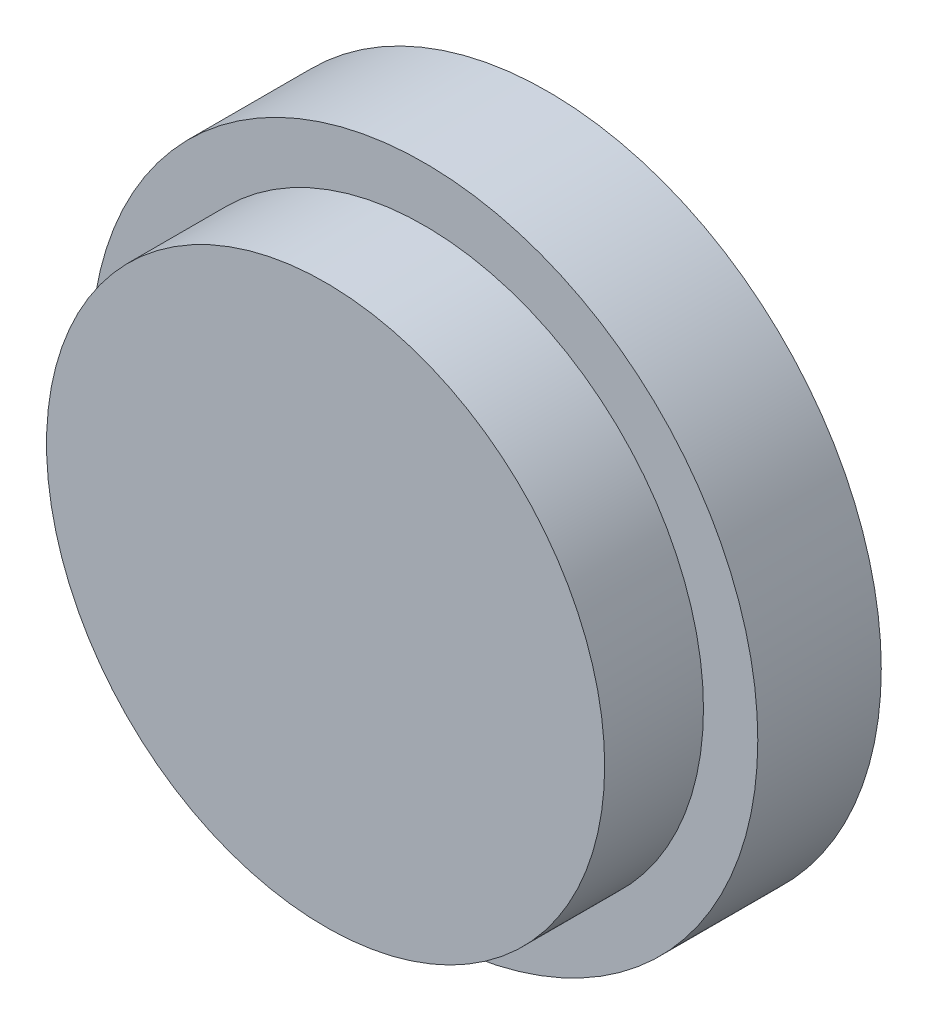
ISO-10303-21;
HEADER;
FILE_DESCRIPTION(('STEP AP214'),'2;1');
FILE_NAME('part.step','',(''),(''),'','','');
FILE_SCHEMA(('AUTOMOTIVE_DESIGN { 1 0 10303 214 1 1 1 1 }'));
ENDSEC;
DATA;
#1=APPLICATION_CONTEXT('core data for automotive mechanical design processes');
#2=APPLICATION_PROTOCOL_DEFINITION('international standard','automotive_design',2000,#1);
#3=PRODUCT_CONTEXT('',#1,'mechanical');
#4=PRODUCT('Part','Part','',(#3));
#5=PRODUCT_RELATED_PRODUCT_CATEGORY('part','',(#4));
#6=PRODUCT_DEFINITION_FORMATION('','',#4);
#7=PRODUCT_DEFINITION_CONTEXT('part definition',#1,'design');
#8=PRODUCT_DEFINITION('design','',#6,#7);
#9=PRODUCT_DEFINITION_SHAPE('','',#8);
#10=(LENGTH_UNIT() NAMED_UNIT(*) SI_UNIT(.MILLI.,.METRE.));
#11=(NAMED_UNIT(*) PLANE_ANGLE_UNIT() SI_UNIT($,.RADIAN.));
#12=(NAMED_UNIT(*) SI_UNIT($,.STERADIAN.) SOLID_ANGLE_UNIT());
#13=UNCERTAINTY_MEASURE_WITH_UNIT(LENGTH_MEASURE(1.E-05),#10,'distance_accuracy_value','');
#14=(GEOMETRIC_REPRESENTATION_CONTEXT(3) GLOBAL_UNCERTAINTY_ASSIGNED_CONTEXT((#13)) GLOBAL_UNIT_ASSIGNED_CONTEXT((#10,
#11,#12)) REPRESENTATION_CONTEXT('',''));
#15=CARTESIAN_POINT('',(0.,0.,0.));
#16=DIRECTION('',(0.,0.,1.));
#17=DIRECTION('',(1.,0.,0.));
#18=AXIS2_PLACEMENT_3D('',#15,#16,#17);
#19=CARTESIAN_POINT('',(0.,0.,5.));
#20=DIRECTION('',(0.,0.,-1.));
#21=DIRECTION('',(-1.,0.,0.));
#22=AXIS2_PLACEMENT_3D('',#19,#20,#21);
#23=CYLINDRICAL_SURFACE('',#22,13.5);
#24=CARTESIAN_POINT('',(0.,0.,5.));
#25=DIRECTION('',(0.,0.,1.));
#26=DIRECTION('',(1.,0.,0.));
#27=AXIS2_PLACEMENT_3D('',#24,#25,#26);
#28=CIRCLE('',#27,13.5);
#29=CARTESIAN_POINT('',(13.5,0.,5.));
#30=VERTEX_POINT('',#29);
#31=EDGE_CURVE('E54',#30,#30,#28,.T.);
#32=ORIENTED_EDGE('',*,*,#31,.F.);
#33=EDGE_LOOP('',(#32));
#34=FACE_BOUND('',#33,.T.);
#35=CARTESIAN_POINT('',(0.,0.,0.));
#36=DIRECTION('',(0.,0.,1.));
#37=DIRECTION('',(1.,0.,0.));
#38=AXIS2_PLACEMENT_3D('',#35,#36,#37);
#39=CIRCLE('',#38,13.5);
#40=CARTESIAN_POINT('',(13.5,0.,0.));
#41=VERTEX_POINT('',#40);
#42=EDGE_CURVE('E49',#41,#41,#39,.T.);
#43=ORIENTED_EDGE('',*,*,#42,.T.);
#44=EDGE_LOOP('',(#43));
#45=FACE_BOUND('',#44,.T.);
#46=ADVANCED_FACE('F50',(#34,#45),#23,.T.);
#47=CARTESIAN_POINT('',(0.,0.,5.));
#48=DIRECTION('',(0.,0.,1.));
#49=DIRECTION('',(1.,0.,0.));
#50=AXIS2_PLACEMENT_3D('',#47,#48,#49);
#51=PLANE('',#50);
#52=CARTESIAN_POINT('',(0.,0.,5.));
#53=DIRECTION('',(0.,0.,1.));
#54=DIRECTION('',(1.,0.,0.));
#55=AXIS2_PLACEMENT_3D('',#52,#53,#54);
#56=CIRCLE('',#55,11.3);
#57=CARTESIAN_POINT('',(11.3,0.,5.));
#58=VERTEX_POINT('',#57);
#59=EDGE_CURVE('E11',#58,#58,#56,.T.);
#60=ORIENTED_EDGE('',*,*,#59,.F.);
#61=EDGE_LOOP('',(#60));
#62=FACE_BOUND('',#61,.T.);
#63=ORIENTED_EDGE('',*,*,#31,.T.);
#64=EDGE_LOOP('',(#63));
#65=FACE_BOUND('',#64,.T.);
#66=ADVANCED_FACE('F74',(#62,#65),#51,.T.);
#67=CARTESIAN_POINT('',(0.,0.,0.));
#68=DIRECTION('',(0.,0.,1.));
#69=DIRECTION('',(1.,0.,0.));
#70=AXIS2_PLACEMENT_3D('',#67,#68,#69);
#71=PLANE('',#70);
#72=ORIENTED_EDGE('',*,*,#42,.F.);
#73=EDGE_LOOP('',(#72));
#74=FACE_BOUND('',#73,.T.);
#75=ADVANCED_FACE('F72',(#74),#71,.F.);
#76=CARTESIAN_POINT('',(0.,0.,9.));
#77=DIRECTION('',(0.,0.,-1.));
#78=DIRECTION('',(-1.,0.,0.));
#79=AXIS2_PLACEMENT_3D('',#76,#77,#78);
#80=CYLINDRICAL_SURFACE('',#79,11.3);
#81=CARTESIAN_POINT('',(0.,0.,9.));
#82=DIRECTION('',(0.,0.,1.));
#83=DIRECTION('',(1.,0.,0.));
#84=AXIS2_PLACEMENT_3D('',#81,#82,#83);
#85=CIRCLE('',#84,11.3);
#86=CARTESIAN_POINT('',(11.3,0.,9.));
#87=VERTEX_POINT('',#86);
#88=EDGE_CURVE('E64',#87,#87,#85,.T.);
#89=ORIENTED_EDGE('',*,*,#88,.F.);
#90=EDGE_LOOP('',(#89));
#91=FACE_BOUND('',#90,.T.);
#92=ORIENTED_EDGE('',*,*,#59,.T.);
#93=EDGE_LOOP('',(#92));
#94=FACE_BOUND('',#93,.T.);
#95=ADVANCED_FACE('F71',(#91,#94),#80,.T.);
#96=CARTESIAN_POINT('',(0.,0.,9.));
#97=DIRECTION('',(0.,0.,1.));
#98=DIRECTION('',(1.,0.,0.));
#99=AXIS2_PLACEMENT_3D('',#96,#97,#98);
#100=PLANE('',#99);
#101=ORIENTED_EDGE('',*,*,#88,.T.);
#102=EDGE_LOOP('',(#101));
#103=FACE_BOUND('',#102,.T.);
#104=ADVANCED_FACE('F76',(#103),#100,.T.);
#105=CLOSED_SHELL('',(#46,#66,#75,#95,#104));
#106=MANIFOLD_SOLID_BREP('B2',#105);
#107=ADVANCED_BREP_SHAPE_REPRESENTATION('',(#18,#106),#14);
#108=SHAPE_DEFINITION_REPRESENTATION(#9,#107);
ENDSEC;
END-ISO-10303-21;
